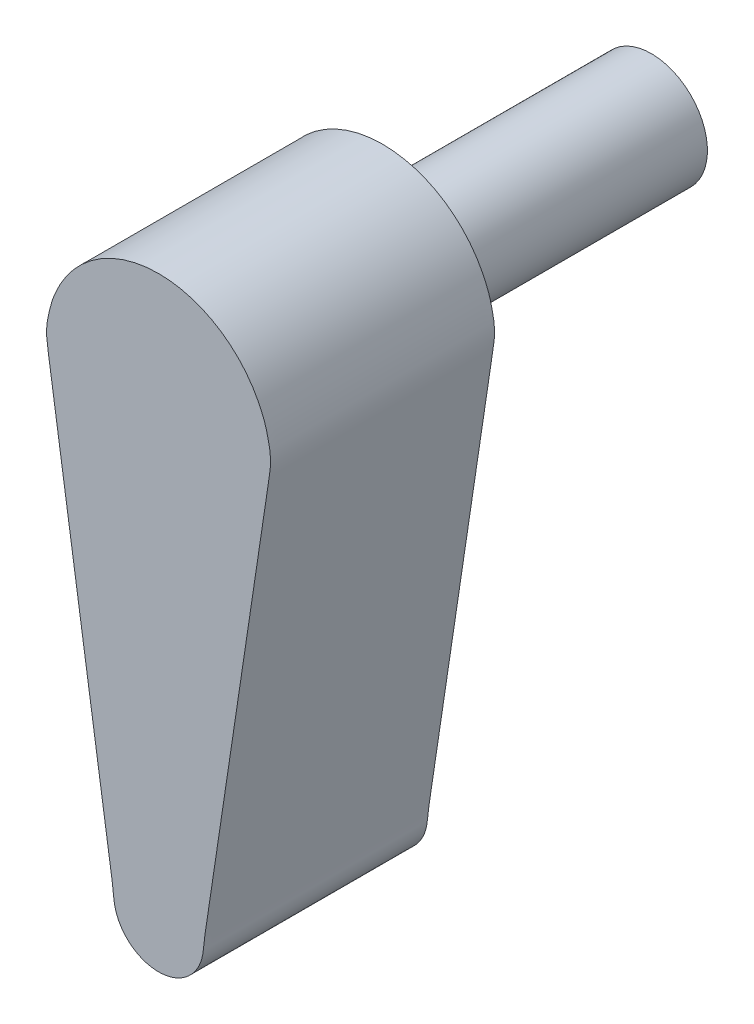
ISO-10303-21;
HEADER;
FILE_DESCRIPTION(('STEP AP214'),'2;1');
FILE_NAME('part.step','',(''),(''),'','','');
FILE_SCHEMA(('AUTOMOTIVE_DESIGN { 1 0 10303 214 1 1 1 1 }'));
ENDSEC;
DATA;
#1=APPLICATION_CONTEXT('core data for automotive mechanical design processes');
#2=APPLICATION_PROTOCOL_DEFINITION('international standard','automotive_design',2000,#1);
#3=PRODUCT_CONTEXT('',#1,'mechanical');
#4=PRODUCT('Part','Part','',(#3));
#5=PRODUCT_RELATED_PRODUCT_CATEGORY('part','',(#4));
#6=PRODUCT_DEFINITION_FORMATION('','',#4);
#7=PRODUCT_DEFINITION_CONTEXT('part definition',#1,'design');
#8=PRODUCT_DEFINITION('design','',#6,#7);
#9=PRODUCT_DEFINITION_SHAPE('','',#8);
#10=(LENGTH_UNIT() NAMED_UNIT(*) SI_UNIT(.MILLI.,.METRE.));
#11=(NAMED_UNIT(*) PLANE_ANGLE_UNIT() SI_UNIT($,.RADIAN.));
#12=(NAMED_UNIT(*) SI_UNIT($,.STERADIAN.) SOLID_ANGLE_UNIT());
#13=UNCERTAINTY_MEASURE_WITH_UNIT(LENGTH_MEASURE(1.E-05),#10,'distance_accuracy_value','');
#14=(GEOMETRIC_REPRESENTATION_CONTEXT(3) GLOBAL_UNCERTAINTY_ASSIGNED_CONTEXT((#13)) GLOBAL_UNIT_ASSIGNED_CONTEXT((#10,
#11,#12)) REPRESENTATION_CONTEXT('',''));
#15=CARTESIAN_POINT('',(0.,0.,0.));
#16=DIRECTION('',(0.,0.,1.));
#17=DIRECTION('',(1.,0.,0.));
#18=AXIS2_PLACEMENT_3D('',#15,#16,#17);
#19=CARTESIAN_POINT('',(2.23116534057831,12.1277859828008,5.));
#20=CARTESIAN_POINT('',(1.17292165733002,14.2213717020396,5.));
#21=CARTESIAN_POINT('',(-1.17292165733007,14.2213717020396,5.));
#22=CARTESIAN_POINT('',(-2.23116534057833,12.1277859828008,5.));
#23=CARTESIAN_POINT('',(-2.26042176983711,12.0699062680794,5.));
#24=CARTESIAN_POINT('',(-2.31443017324062,11.9518699740559,5.));
#25=CARTESIAN_POINT('',(-2.38674857279432,11.7689507464897,5.));
#26=CARTESIAN_POINT('',(-2.41682472394939,11.6427785417515,5.));
#27=CARTESIAN_POINT('',(-2.43186279952692,11.5796924393824,5.));
#28=CARTESIAN_POINT('',(-2.45262984896534,11.4925727677182,5.));
#29=CARTESIAN_POINT('',(-2.49416394784217,11.3183334243897,5.));
#30=CARTESIAN_POINT('',(-2.50601288110024,11.0400858740016,5.));
#31=CARTESIAN_POINT('',(-2.47944195046155,10.8629463364104,5.));
#32=CARTESIAN_POINT('',(-2.46615648514221,10.7743765676148,5.));
#33=CARTESIAN_POINT('',(-2.44508798238432,10.6339198825622,5.));
#34=CARTESIAN_POINT('',(-2.40295097686854,10.353006512457,5.));
#35=CARTESIAN_POINT('',(-2.33974546859488,9.93163645729917,5.));
#36=CARTESIAN_POINT('',(-2.2976084630791,9.65072308719398,5.));
#37=CARTESIAN_POINT('',(-2.27653996032121,9.51026640214138,5.));
#38=CARTESIAN_POINT('',(-1.86405185908381,6.76034572722538,5.));
#39=CARTESIAN_POINT('',(-1.45156375784641,4.01042505230939,5.));
#40=CARTESIAN_POINT('',(-1.03907565660901,1.2605043773934,5.));
#41=CARTESIAN_POINT('',(-1.03029230394523,1.20194869296822,5.));
#42=CARTESIAN_POINT('',(-1.01272559861768,1.08483732411787,5.));
#43=CARTESIAN_POINT('',(-1.00098524906213,0.906957533692142,5.));
#44=CARTESIAN_POINT('',(-0.979498600221833,0.790027602704583,5.));
#45=CARTESIAN_POINT('',(-0.963687366144686,0.732966930263095,5.));
#46=CARTESIAN_POINT('',(-0.628191537084079,-0.477793565350762,5.));
#47=CARTESIAN_POINT('',(0.628191537084057,-0.477793565350773,5.));
#48=CARTESIAN_POINT('',(0.963687366144685,0.732966930263079,5.));
#49=CARTESIAN_POINT('',(0.979498600221833,0.79002760270457,5.));
#50=CARTESIAN_POINT('',(1.00098524906213,0.906957533692136,5.));
#51=CARTESIAN_POINT('',(1.01272559861768,1.08483732411787,5.));
#52=CARTESIAN_POINT('',(1.03029230394524,1.20194869296823,5.));
#53=CARTESIAN_POINT('',(1.03907565660901,1.26050437739341,5.));
#54=CARTESIAN_POINT('',(1.45156375784641,4.01042505230939,5.));
#55=CARTESIAN_POINT('',(1.86405185908381,6.76034572722536,5.));
#56=CARTESIAN_POINT('',(2.2765399603212,9.51026640214133,4.99999999999999));
#57=CARTESIAN_POINT('',(2.29760846307909,9.65072308719394,4.99999999999999));
#58=CARTESIAN_POINT('',(2.33974546859487,9.93163645729914,4.99999999999999));
#59=CARTESIAN_POINT('',(2.40295097686854,10.353006512457,5.));
#60=CARTESIAN_POINT('',(2.44508798238432,10.6339198825622,5.));
#61=CARTESIAN_POINT('',(2.46615648514221,10.7743765676148,5.));
#62=CARTESIAN_POINT('',(2.47944195046156,10.8629463364104,5.));
#63=CARTESIAN_POINT('',(2.50601288110024,11.0400858740016,5.));
#64=CARTESIAN_POINT('',(2.49416394784217,11.3183334243897,5.));
#65=CARTESIAN_POINT('',(2.45262984896533,11.4925727677182,5.));
#66=CARTESIAN_POINT('',(2.43186279952692,11.5796924393824,5.00000000000001));
#67=CARTESIAN_POINT('',(2.41682472394938,11.6427785417515,5.00000000000001));
#68=CARTESIAN_POINT('',(2.38674857279431,11.7689507464898,5.00000000000001));
#69=CARTESIAN_POINT('',(2.31443017324061,11.9518699740559,5.00000000000001));
#70=CARTESIAN_POINT('',(2.2604217698371,12.0699062680795,5.00000000000001));
#71=CARTESIAN_POINT('',(2.23116534057831,12.1277859828008,5.00000000000001));
#72=(BOUNDED_CURVE() B_SPLINE_CURVE(3,(#19,#20,#21,#22,#23,#24,#25,#26,#27,#28,#29,#30,#31,#32,
#33,#34,#35,#36,#37,#38,#39,#40,#41,#42,#43,#44,#45,#46,#47,#48,#49,#50,#51,#52,#53,#54,#55,#56,
#57,#58,#59,#60,#61,#62,#63,#64,#65,#66,#67,#68,#69,#70,#71),.UNSPECIFIED.,.T.,
.F.) B_SPLINE_CURVE_WITH_KNOTS((4,3,1,1,3,1,1,3,1,1,3,3,1,1,3,3,1,1,3,3,1,1,3,1,1,3,1,1,4),(0.,
0.151390804644597,0.157991560005829,0.164592315367061,0.171193070728292,0.180308479958072,
0.189423889187852,0.198539298417633,0.212994796955372,0.227450295493111,0.24190579403085,
0.524921688078618,0.530948112597092,0.536974537115565,0.543000961634038,0.608389843010558,
0.614416267529031,0.620442692047505,0.626469116565979,0.909485010613745,0.923940509151485,
0.938396007689224,0.952851506226964,0.961966915456744,0.971082324686524,0.980197733916305,
0.986798489277536,0.993399244638768,1.),
.UNSPECIFIED.) CURVE() GEOMETRIC_REPRESENTATION_ITEM() RATIONAL_B_SPLINE_CURVE((1.,
0.634076262080221,0.634076262080221,1.,1.,1.,1.,1.,1.,1.,1.,1.,1.,1.,1.,1.,1.,1.,1.,1.,1.,1.,1.,
1.,1.,1.,1.,0.511355379824609,0.511355379824609,1.,1.,1.,1.,1.,1.,1.,1.,1.,1.,1.,1.,1.,1.,1.,1.,
1.,1.,1.,1.,1.,1.,1.,1.)) REPRESENTATION_ITEM(''));
#73=DIRECTION('',(0.,0.,-1.));
#74=VECTOR('',#73,1.);
#75=SURFACE_OF_LINEAR_EXTRUSION('',#72,#74);
#76=CARTESIAN_POINT('',(2.23116534057831,12.1277859828008,5.));
#77=VERTEX_POINT('',#76);
#78=EDGE_CURVE('E10',#77,#77,#72,.T.);
#79=ORIENTED_EDGE('',*,*,#78,.F.);
#80=EDGE_LOOP('',(#79));
#81=FACE_BOUND('',#80,.T.);
#82=CARTESIAN_POINT('',(2.23116534057831,12.1277859828008,0.));
#83=CARTESIAN_POINT('',(1.17292165733002,14.2213717020396,0.));
#84=CARTESIAN_POINT('',(-1.17292165733007,14.2213717020396,0.));
#85=CARTESIAN_POINT('',(-2.23116534057833,12.1277859828008,0.));
#86=CARTESIAN_POINT('',(-2.26042176983711,12.0699062680794,0.));
#87=CARTESIAN_POINT('',(-2.31443017324062,11.9518699740559,0.));
#88=CARTESIAN_POINT('',(-2.38674857279432,11.7689507464897,0.));
#89=CARTESIAN_POINT('',(-2.41682472394939,11.6427785417515,0.));
#90=CARTESIAN_POINT('',(-2.43186279952692,11.5796924393824,0.));
#91=CARTESIAN_POINT('',(-2.45262984896534,11.4925727677182,0.));
#92=CARTESIAN_POINT('',(-2.49416394784217,11.3183334243897,0.));
#93=CARTESIAN_POINT('',(-2.50601288110024,11.0400858740016,0.));
#94=CARTESIAN_POINT('',(-2.47944195046155,10.8629463364104,0.));
#95=CARTESIAN_POINT('',(-2.46615648514221,10.7743765676148,0.));
#96=CARTESIAN_POINT('',(-2.44508798238432,10.6339198825622,0.));
#97=CARTESIAN_POINT('',(-2.40295097686854,10.353006512457,0.));
#98=CARTESIAN_POINT('',(-2.33974546859488,9.93163645729917,0.));
#99=CARTESIAN_POINT('',(-2.2976084630791,9.65072308719398,0.));
#100=CARTESIAN_POINT('',(-2.27653996032121,9.51026640214138,0.));
#101=CARTESIAN_POINT('',(-1.86405185908381,6.76034572722538,0.));
#102=CARTESIAN_POINT('',(-1.45156375784641,4.01042505230939,0.));
#103=CARTESIAN_POINT('',(-1.03907565660901,1.2605043773934,0.));
#104=CARTESIAN_POINT('',(-1.03029230394523,1.20194869296822,0.));
#105=CARTESIAN_POINT('',(-1.01272559861768,1.08483732411787,0.));
#106=CARTESIAN_POINT('',(-1.00098524906213,0.906957533692142,0.));
#107=CARTESIAN_POINT('',(-0.979498600221833,0.790027602704583,0.));
#108=CARTESIAN_POINT('',(-0.963687366144686,0.732966930263095,0.));
#109=CARTESIAN_POINT('',(-0.628191537084079,-0.477793565350762,0.));
#110=CARTESIAN_POINT('',(0.628191537084057,-0.477793565350773,0.));
#111=CARTESIAN_POINT('',(0.963687366144685,0.732966930263079,0.));
#112=CARTESIAN_POINT('',(0.979498600221833,0.79002760270457,0.));
#113=CARTESIAN_POINT('',(1.00098524906213,0.906957533692136,0.));
#114=CARTESIAN_POINT('',(1.01272559861768,1.08483732411787,0.));
#115=CARTESIAN_POINT('',(1.03029230394524,1.20194869296823,0.));
#116=CARTESIAN_POINT('',(1.03907565660901,1.26050437739341,0.));
#117=CARTESIAN_POINT('',(1.45156375784641,4.01042505230939,0.));
#118=CARTESIAN_POINT('',(1.86405185908381,6.76034572722536,0.));
#119=CARTESIAN_POINT('',(2.2765399603212,9.51026640214133,0.));
#120=CARTESIAN_POINT('',(2.29760846307909,9.65072308719394,0.));
#121=CARTESIAN_POINT('',(2.33974546859487,9.93163645729914,0.));
#122=CARTESIAN_POINT('',(2.40295097686854,10.353006512457,0.));
#123=CARTESIAN_POINT('',(2.44508798238432,10.6339198825622,0.));
#124=CARTESIAN_POINT('',(2.46615648514221,10.7743765676148,0.));
#125=CARTESIAN_POINT('',(2.47944195046156,10.8629463364104,0.));
#126=CARTESIAN_POINT('',(2.50601288110024,11.0400858740016,0.));
#127=CARTESIAN_POINT('',(2.49416394784217,11.3183334243897,0.));
#128=CARTESIAN_POINT('',(2.45262984896533,11.4925727677182,0.));
#129=CARTESIAN_POINT('',(2.43186279952692,11.5796924393824,0.));
#130=CARTESIAN_POINT('',(2.41682472394938,11.6427785417515,0.));
#131=CARTESIAN_POINT('',(2.38674857279431,11.7689507464898,0.));
#132=CARTESIAN_POINT('',(2.31443017324061,11.9518699740559,0.));
#133=CARTESIAN_POINT('',(2.2604217698371,12.0699062680795,0.));
#134=CARTESIAN_POINT('',(2.23116534057831,12.1277859828008,0.));
#135=(BOUNDED_CURVE() B_SPLINE_CURVE(3,(#82,#83,#84,#85,#86,#87,#88,#89,#90,#91,#92,#93,#94,#95,
#96,#97,#98,#99,#100,#101,#102,#103,#104,#105,#106,#107,#108,#109,#110,#111,#112,#113,#114,#115,
#116,#117,#118,#119,#120,#121,#122,#123,#124,#125,#126,#127,#128,#129,#130,#131,#132,#133,#134),
.UNSPECIFIED.,.T.,.F.) B_SPLINE_CURVE_WITH_KNOTS((4,3,1,1,3,1,1,3,1,1,3,3,1,1,3,3,1,1,3,3,1,1,3,
1,1,3,1,1,4),(0.,0.151390804644597,0.157991560005829,0.164592315367061,0.171193070728292,
0.180308479958072,0.189423889187852,0.198539298417633,0.212994796955372,0.227450295493111,
0.24190579403085,0.524921688078618,0.530948112597092,0.536974537115565,0.543000961634038,
0.608389843010558,0.614416267529031,0.620442692047505,0.626469116565979,0.909485010613745,
0.923940509151485,0.938396007689224,0.952851506226964,0.961966915456744,0.971082324686524,
0.980197733916305,0.986798489277536,0.993399244638768,1.),
.UNSPECIFIED.) CURVE() GEOMETRIC_REPRESENTATION_ITEM() RATIONAL_B_SPLINE_CURVE((1.,
0.634076262080221,0.634076262080221,1.,1.,1.,1.,1.,1.,1.,1.,1.,1.,1.,1.,1.,1.,1.,1.,1.,1.,1.,1.,
1.,1.,1.,1.,0.511355379824609,0.511355379824609,1.,1.,1.,1.,1.,1.,1.,1.,1.,1.,1.,1.,1.,1.,1.,1.,
1.,1.,1.,1.,1.,1.,1.,1.)) REPRESENTATION_ITEM(''));
#136=CARTESIAN_POINT('',(2.23116534057831,12.1277859828008,0.));
#137=VERTEX_POINT('',#136);
#138=EDGE_CURVE('E39',#137,#137,#135,.T.);
#139=ORIENTED_EDGE('',*,*,#138,.T.);
#140=EDGE_LOOP('',(#139));
#141=FACE_BOUND('',#140,.T.);
#142=ADVANCED_FACE('F35',(#81,#141),#75,.F.);
#143=CARTESIAN_POINT('',(-1.14804373944161,1.98695826294408,5.));
#144=DIRECTION('',(0.,0.,-1.));
#145=DIRECTION('',(-1.,0.,0.));
#146=AXIS2_PLACEMENT_3D('',#143,#144,#145);
#147=PLANE('',#146);
#148=ORIENTED_EDGE('',*,*,#78,.T.);
#149=EDGE_LOOP('',(#148));
#150=FACE_BOUND('',#149,.T.);
#151=ADVANCED_FACE('F72',(#150),#147,.F.);
#152=CARTESIAN_POINT('',(-1.14804373944161,1.98695826294408,0.));
#153=DIRECTION('',(0.,0.,-1.));
#154=DIRECTION('',(-1.,0.,0.));
#155=AXIS2_PLACEMENT_3D('',#152,#153,#154);
#156=PLANE('',#155);
#157=CARTESIAN_POINT('',(0.,11.,0.));
#158=DIRECTION('',(0.,0.,-1.));
#159=DIRECTION('',(-1.,0.,0.));
#160=AXIS2_PLACEMENT_3D('',#157,#158,#159);
#161=CIRCLE('',#160,1.25);
#162=CARTESIAN_POINT('',(-1.25,11.,0.));
#163=VERTEX_POINT('',#162);
#164=EDGE_CURVE('E52',#163,#163,#161,.T.);
#165=ORIENTED_EDGE('',*,*,#164,.F.);
#166=EDGE_LOOP('',(#165));
#167=FACE_BOUND('',#166,.T.);
#168=ORIENTED_EDGE('',*,*,#138,.F.);
#169=EDGE_LOOP('',(#168));
#170=FACE_BOUND('',#169,.T.);
#171=ADVANCED_FACE('F66',(#167,#170),#156,.T.);
#172=CARTESIAN_POINT('',(0.,11.,-6.));
#173=DIRECTION('',(0.,0.,1.));
#174=DIRECTION('',(1.,0.,0.));
#175=AXIS2_PLACEMENT_3D('',#172,#173,#174);
#176=CYLINDRICAL_SURFACE('',#175,1.25);
#177=CARTESIAN_POINT('',(0.,11.,-6.));
#178=DIRECTION('',(0.,0.,-1.));
#179=DIRECTION('',(-1.,0.,0.));
#180=AXIS2_PLACEMENT_3D('',#177,#178,#179);
#181=CIRCLE('',#180,1.25);
#182=CARTESIAN_POINT('',(-1.25,11.,-6.));
#183=VERTEX_POINT('',#182);
#184=EDGE_CURVE('E47',#183,#183,#181,.T.);
#185=ORIENTED_EDGE('',*,*,#184,.F.);
#186=EDGE_LOOP('',(#185));
#187=FACE_BOUND('',#186,.T.);
#188=ORIENTED_EDGE('',*,*,#164,.T.);
#189=EDGE_LOOP('',(#188));
#190=FACE_BOUND('',#189,.T.);
#191=ADVANCED_FACE('F63',(#187,#190),#176,.T.);
#192=CARTESIAN_POINT('',(0.,11.,-6.));
#193=DIRECTION('',(0.,0.,-1.));
#194=DIRECTION('',(-1.,0.,0.));
#195=AXIS2_PLACEMENT_3D('',#192,#193,#194);
#196=PLANE('',#195);
#197=ORIENTED_EDGE('',*,*,#184,.T.);
#198=EDGE_LOOP('',(#197));
#199=FACE_BOUND('',#198,.T.);
#200=ADVANCED_FACE('F61',(#199),#196,.T.);
#201=CLOSED_SHELL('',(#142,#151,#171,#191,#200));
#202=MANIFOLD_SOLID_BREP('B2',#201);
#203=ADVANCED_BREP_SHAPE_REPRESENTATION('',(#18,#202),#14);
#204=SHAPE_DEFINITION_REPRESENTATION(#9,#203);
ENDSEC;
END-ISO-10303-21;
